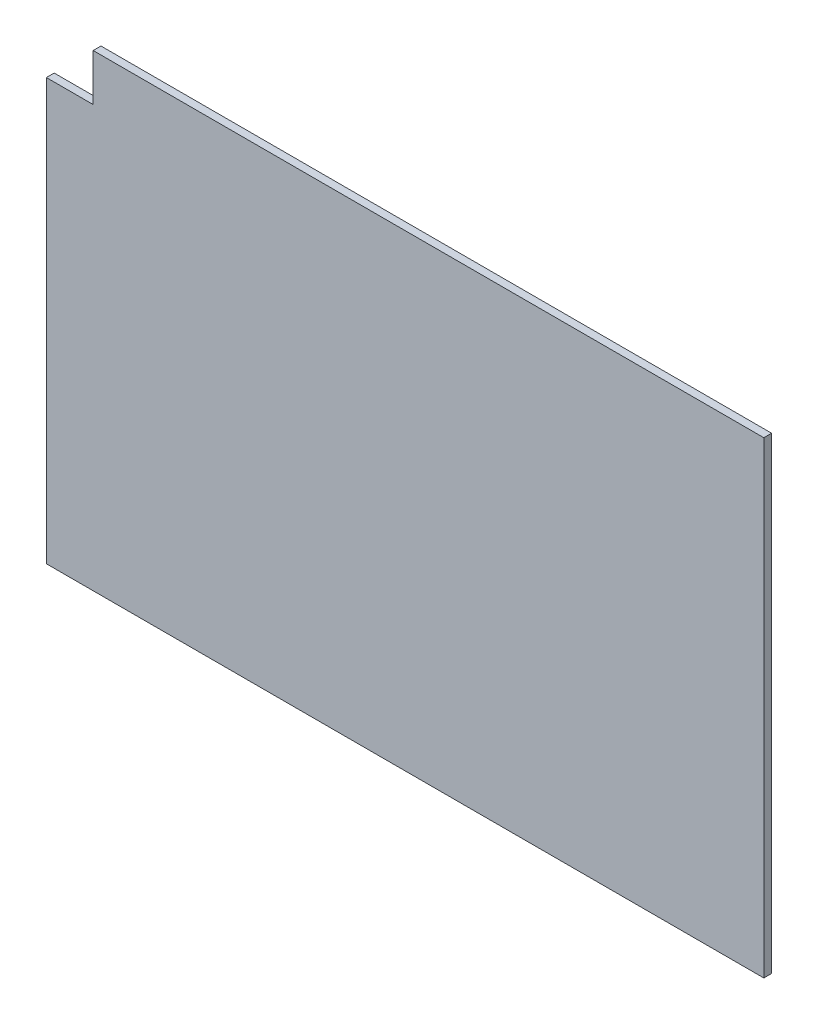
ISO-10303-21;
HEADER;
FILE_DESCRIPTION(('STEP AP214'),'2;1');
FILE_NAME('part.step','',(''),(''),'','','');
FILE_SCHEMA(('AUTOMOTIVE_DESIGN { 1 0 10303 214 1 1 1 1 }'));
ENDSEC;
DATA;
#1=APPLICATION_CONTEXT('core data for automotive mechanical design processes');
#2=APPLICATION_PROTOCOL_DEFINITION('international standard','automotive_design',2000,#1);
#3=PRODUCT_CONTEXT('',#1,'mechanical');
#4=PRODUCT('Part','Part','',(#3));
#5=PRODUCT_RELATED_PRODUCT_CATEGORY('part','',(#4));
#6=PRODUCT_DEFINITION_FORMATION('','',#4);
#7=PRODUCT_DEFINITION_CONTEXT('part definition',#1,'design');
#8=PRODUCT_DEFINITION('design','',#6,#7);
#9=PRODUCT_DEFINITION_SHAPE('','',#8);
#10=(LENGTH_UNIT() NAMED_UNIT(*) SI_UNIT(.MILLI.,.METRE.));
#11=(NAMED_UNIT(*) PLANE_ANGLE_UNIT() SI_UNIT($,.RADIAN.));
#12=(NAMED_UNIT(*) SI_UNIT($,.STERADIAN.) SOLID_ANGLE_UNIT());
#13=UNCERTAINTY_MEASURE_WITH_UNIT(LENGTH_MEASURE(1.E-05),#10,'distance_accuracy_value','');
#14=(GEOMETRIC_REPRESENTATION_CONTEXT(3) GLOBAL_UNCERTAINTY_ASSIGNED_CONTEXT((#13)) GLOBAL_UNIT_ASSIGNED_CONTEXT((#10,
#11,#12)) REPRESENTATION_CONTEXT('',''));
#15=CARTESIAN_POINT('',(0.,0.,0.));
#16=DIRECTION('',(0.,0.,1.));
#17=DIRECTION('',(1.,0.,0.));
#18=AXIS2_PLACEMENT_3D('',#15,#16,#17);
#19=CARTESIAN_POINT('',(0.,0.,0.));
#20=DIRECTION('',(0.,0.,-1.));
#21=DIRECTION('',(-1.,0.,0.));
#22=AXIS2_PLACEMENT_3D('',#19,#20,#21);
#23=PLANE('',#22);
#24=DIRECTION('',(0.,1.,0.));
#25=VECTOR('',#24,1.);
#26=CARTESIAN_POINT('',(0.,0.,0.));
#27=LINE('',#26,#25);
#28=CARTESIAN_POINT('',(0.,0.,0.));
#29=VERTEX_POINT('',#28);
#30=CARTESIAN_POINT('',(0.,270.,0.));
#31=VERTEX_POINT('',#30);
#32=EDGE_CURVE('E88',#29,#31,#27,.T.);
#33=ORIENTED_EDGE('',*,*,#32,.T.);
#34=DIRECTION('',(1.,0.,0.));
#35=VECTOR('',#34,1.);
#36=CARTESIAN_POINT('',(0.,270.,0.));
#37=LINE('',#36,#35);
#38=CARTESIAN_POINT('',(30.,270.,0.));
#39=VERTEX_POINT('',#38);
#40=EDGE_CURVE('E93',#31,#39,#37,.T.);
#41=ORIENTED_EDGE('',*,*,#40,.T.);
#42=DIRECTION('',(0.,1.,0.));
#43=VECTOR('',#42,1.);
#44=CARTESIAN_POINT('',(30.,300.,0.));
#45=LINE('',#44,#43);
#46=CARTESIAN_POINT('',(30.,300.,0.));
#47=VERTEX_POINT('',#46);
#48=EDGE_CURVE('E98',#39,#47,#45,.T.);
#49=ORIENTED_EDGE('',*,*,#48,.T.);
#50=DIRECTION('',(1.,0.,0.));
#51=VECTOR('',#50,1.);
#52=CARTESIAN_POINT('',(0.,300.,0.));
#53=LINE('',#52,#51);
#54=CARTESIAN_POINT('',(460.,300.,0.));
#55=VERTEX_POINT('',#54);
#56=EDGE_CURVE('E70',#47,#55,#53,.T.);
#57=ORIENTED_EDGE('',*,*,#56,.T.);
#58=DIRECTION('',(0.,-1.,0.));
#59=VECTOR('',#58,1.);
#60=CARTESIAN_POINT('',(460.,0.,0.));
#61=LINE('',#60,#59);
#62=CARTESIAN_POINT('',(460.,0.,0.));
#63=VERTEX_POINT('',#62);
#64=EDGE_CURVE('E20',#55,#63,#61,.T.);
#65=ORIENTED_EDGE('',*,*,#64,.T.);
#66=DIRECTION('',(1.,0.,0.));
#67=VECTOR('',#66,1.);
#68=CARTESIAN_POINT('',(0.,0.,0.));
#69=LINE('',#68,#67);
#70=EDGE_CURVE('E67',#63,#29,#69,.F.);
#71=ORIENTED_EDGE('',*,*,#70,.T.);
#72=EDGE_LOOP('',(#33,#41,#49,#57,#65,#71));
#73=FACE_BOUND('',#72,.T.);
#74=ADVANCED_FACE('F17',(#73),#23,.T.);
#75=CARTESIAN_POINT('',(460.,0.,5.));
#76=DIRECTION('',(-1.,0.,0.));
#77=DIRECTION('',(0.,-1.,0.));
#78=AXIS2_PLACEMENT_3D('',#75,#76,#77);
#79=PLANE('',#78);
#80=DIRECTION('',(0.,0.,-1.));
#81=VECTOR('',#80,1.);
#82=CARTESIAN_POINT('',(460.,300.,5.));
#83=LINE('',#82,#81);
#84=CARTESIAN_POINT('',(460.,300.,5.));
#85=VERTEX_POINT('',#84);
#86=EDGE_CURVE('E100',#55,#85,#83,.F.);
#87=ORIENTED_EDGE('',*,*,#86,.T.);
#88=DIRECTION('',(0.,1.,0.));
#89=VECTOR('',#88,1.);
#90=CARTESIAN_POINT('',(460.,0.,5.));
#91=LINE('',#90,#89);
#92=CARTESIAN_POINT('',(460.,0.,5.));
#93=VERTEX_POINT('',#92);
#94=EDGE_CURVE('E85',#85,#93,#91,.F.);
#95=ORIENTED_EDGE('',*,*,#94,.T.);
#96=DIRECTION('',(0.,0.,1.));
#97=VECTOR('',#96,1.);
#98=CARTESIAN_POINT('',(460.,0.,5.));
#99=LINE('',#98,#97);
#100=EDGE_CURVE('E75',#93,#63,#99,.F.);
#101=ORIENTED_EDGE('',*,*,#100,.T.);
#102=ORIENTED_EDGE('',*,*,#64,.F.);
#103=EDGE_LOOP('',(#87,#95,#101,#102));
#104=FACE_BOUND('',#103,.T.);
#105=ADVANCED_FACE('F84',(#104),#79,.F.);
#106=CARTESIAN_POINT('',(0.,0.,5.));
#107=DIRECTION('',(0.,1.,0.));
#108=DIRECTION('',(0.,0.,1.));
#109=AXIS2_PLACEMENT_3D('',#106,#107,#108);
#110=PLANE('',#109);
#111=ORIENTED_EDGE('',*,*,#100,.F.);
#112=DIRECTION('',(-1.,0.,0.));
#113=VECTOR('',#112,1.);
#114=CARTESIAN_POINT('',(0.,0.,5.));
#115=LINE('',#114,#113);
#116=CARTESIAN_POINT('',(0.,0.,5.));
#117=VERTEX_POINT('',#116);
#118=EDGE_CURVE('E105',#93,#117,#115,.T.);
#119=ORIENTED_EDGE('',*,*,#118,.T.);
#120=DIRECTION('',(0.,0.,-1.));
#121=VECTOR('',#120,1.);
#122=CARTESIAN_POINT('',(0.,0.,5.));
#123=LINE('',#122,#121);
#124=EDGE_CURVE('E81',#117,#29,#123,.T.);
#125=ORIENTED_EDGE('',*,*,#124,.T.);
#126=ORIENTED_EDGE('',*,*,#70,.F.);
#127=EDGE_LOOP('',(#111,#119,#125,#126));
#128=FACE_BOUND('',#127,.T.);
#129=ADVANCED_FACE('F78',(#128),#110,.F.);
#130=CARTESIAN_POINT('',(0.,0.,5.));
#131=DIRECTION('',(1.,0.,0.));
#132=DIRECTION('',(0.,0.,-1.));
#133=AXIS2_PLACEMENT_3D('',#130,#131,#132);
#134=PLANE('',#133);
#135=DIRECTION('',(0.,0.,-1.));
#136=VECTOR('',#135,1.);
#137=CARTESIAN_POINT('',(0.,270.,0.));
#138=LINE('',#137,#136);
#139=CARTESIAN_POINT('',(0.,270.,5.));
#140=VERTEX_POINT('',#139);
#141=EDGE_CURVE('E90',#140,#31,#138,.T.);
#142=ORIENTED_EDGE('',*,*,#141,.T.);
#143=ORIENTED_EDGE('',*,*,#32,.F.);
#144=ORIENTED_EDGE('',*,*,#124,.F.);
#145=DIRECTION('',(0.,1.,0.));
#146=VECTOR('',#145,1.);
#147=CARTESIAN_POINT('',(0.,0.,5.));
#148=LINE('',#147,#146);
#149=EDGE_CURVE('E107',#117,#140,#148,.T.);
#150=ORIENTED_EDGE('',*,*,#149,.T.);
#151=EDGE_LOOP('',(#142,#143,#144,#150));
#152=FACE_BOUND('',#151,.T.);
#153=ADVANCED_FACE('F126',(#152),#134,.F.);
#154=CARTESIAN_POINT('',(0.,270.,0.));
#155=DIRECTION('',(0.,-1.,0.));
#156=DIRECTION('',(0.,0.,-1.));
#157=AXIS2_PLACEMENT_3D('',#154,#155,#156);
#158=PLANE('',#157);
#159=DIRECTION('',(0.,0.,-1.));
#160=VECTOR('',#159,1.);
#161=CARTESIAN_POINT('',(30.,270.,0.));
#162=LINE('',#161,#160);
#163=CARTESIAN_POINT('',(30.,270.,5.));
#164=VERTEX_POINT('',#163);
#165=EDGE_CURVE('E95',#164,#39,#162,.T.);
#166=ORIENTED_EDGE('',*,*,#165,.T.);
#167=ORIENTED_EDGE('',*,*,#40,.F.);
#168=ORIENTED_EDGE('',*,*,#141,.F.);
#169=DIRECTION('',(-1.,0.,0.));
#170=VECTOR('',#169,1.);
#171=CARTESIAN_POINT('',(0.,270.,5.));
#172=LINE('',#171,#170);
#173=EDGE_CURVE('E110',#140,#164,#172,.F.);
#174=ORIENTED_EDGE('',*,*,#173,.T.);
#175=EDGE_LOOP('',(#166,#167,#168,#174));
#176=FACE_BOUND('',#175,.T.);
#177=ADVANCED_FACE('F123',(#176),#158,.F.);
#178=CARTESIAN_POINT('',(30.,300.,0.));
#179=DIRECTION('',(1.,0.,0.));
#180=DIRECTION('',(0.,0.,-1.));
#181=AXIS2_PLACEMENT_3D('',#178,#179,#180);
#182=PLANE('',#181);
#183=DIRECTION('',(0.,0.,-1.));
#184=VECTOR('',#183,1.);
#185=CARTESIAN_POINT('',(30.,300.,5.));
#186=LINE('',#185,#184);
#187=CARTESIAN_POINT('',(30.,300.,5.));
#188=VERTEX_POINT('',#187);
#189=EDGE_CURVE('E34',#188,#47,#186,.T.);
#190=ORIENTED_EDGE('',*,*,#189,.T.);
#191=ORIENTED_EDGE('',*,*,#48,.F.);
#192=ORIENTED_EDGE('',*,*,#165,.F.);
#193=DIRECTION('',(0.,1.,0.));
#194=VECTOR('',#193,1.);
#195=CARTESIAN_POINT('',(30.,0.,5.));
#196=LINE('',#195,#194);
#197=EDGE_CURVE('E26',#164,#188,#196,.T.);
#198=ORIENTED_EDGE('',*,*,#197,.T.);
#199=EDGE_LOOP('',(#190,#191,#192,#198));
#200=FACE_BOUND('',#199,.T.);
#201=ADVANCED_FACE('F116',(#200),#182,.F.);
#202=CARTESIAN_POINT('',(0.,300.,5.));
#203=DIRECTION('',(0.,-1.,0.));
#204=DIRECTION('',(0.,0.,-1.));
#205=AXIS2_PLACEMENT_3D('',#202,#203,#204);
#206=PLANE('',#205);
#207=ORIENTED_EDGE('',*,*,#189,.F.);
#208=DIRECTION('',(-1.,0.,0.));
#209=VECTOR('',#208,1.);
#210=CARTESIAN_POINT('',(0.,300.,5.));
#211=LINE('',#210,#209);
#212=EDGE_CURVE('E11',#188,#85,#211,.F.);
#213=ORIENTED_EDGE('',*,*,#212,.T.);
#214=ORIENTED_EDGE('',*,*,#86,.F.);
#215=ORIENTED_EDGE('',*,*,#56,.F.);
#216=EDGE_LOOP('',(#207,#213,#214,#215));
#217=FACE_BOUND('',#216,.T.);
#218=ADVANCED_FACE('F127',(#217),#206,.F.);
#219=CARTESIAN_POINT('',(0.,0.,5.));
#220=DIRECTION('',(0.,0.,-1.));
#221=DIRECTION('',(-1.,0.,0.));
#222=AXIS2_PLACEMENT_3D('',#219,#220,#221);
#223=PLANE('',#222);
#224=ORIENTED_EDGE('',*,*,#197,.F.);
#225=ORIENTED_EDGE('',*,*,#173,.F.);
#226=ORIENTED_EDGE('',*,*,#149,.F.);
#227=ORIENTED_EDGE('',*,*,#118,.F.);
#228=ORIENTED_EDGE('',*,*,#94,.F.);
#229=ORIENTED_EDGE('',*,*,#212,.F.);
#230=EDGE_LOOP('',(#224,#225,#226,#227,#228,#229));
#231=FACE_BOUND('',#230,.T.);
#232=ADVANCED_FACE('F120',(#231),#223,.F.);
#233=CLOSED_SHELL('',(#74,#105,#129,#153,#177,#201,#218,#232));
#234=MANIFOLD_SOLID_BREP('B1',#233);
#235=ADVANCED_BREP_SHAPE_REPRESENTATION('',(#18,#234),#14);
#236=SHAPE_DEFINITION_REPRESENTATION(#9,#235);
ENDSEC;
END-ISO-10303-21;
